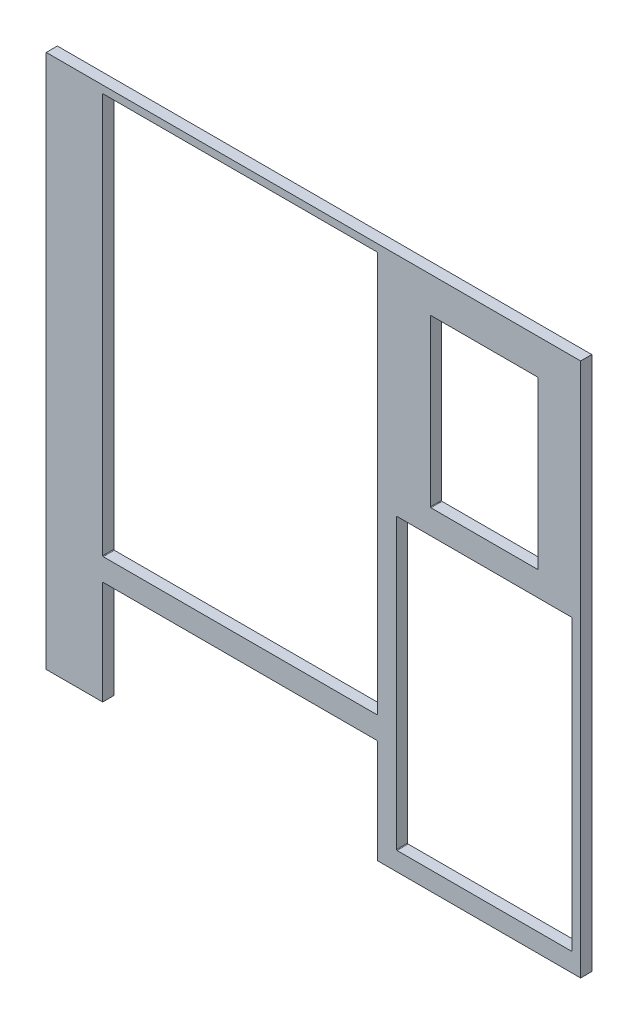
ISO-10303-21;
HEADER;
FILE_DESCRIPTION(('STEP AP214'),'2;1');
FILE_NAME('part.step','',(''),(''),'','','');
FILE_SCHEMA(('AUTOMOTIVE_DESIGN { 1 0 10303 214 1 1 1 1 }'));
ENDSEC;
DATA;
#1=APPLICATION_CONTEXT('core data for automotive mechanical design processes');
#2=APPLICATION_PROTOCOL_DEFINITION('international standard','automotive_design',2000,#1);
#3=PRODUCT_CONTEXT('',#1,'mechanical');
#4=PRODUCT('Part','Part','',(#3));
#5=PRODUCT_RELATED_PRODUCT_CATEGORY('part','',(#4));
#6=PRODUCT_DEFINITION_FORMATION('','',#4);
#7=PRODUCT_DEFINITION_CONTEXT('part definition',#1,'design');
#8=PRODUCT_DEFINITION('design','',#6,#7);
#9=PRODUCT_DEFINITION_SHAPE('','',#8);
#10=(LENGTH_UNIT() NAMED_UNIT(*) SI_UNIT(.MILLI.,.METRE.));
#11=(NAMED_UNIT(*) PLANE_ANGLE_UNIT() SI_UNIT($,.RADIAN.));
#12=(NAMED_UNIT(*) SI_UNIT($,.STERADIAN.) SOLID_ANGLE_UNIT());
#13=UNCERTAINTY_MEASURE_WITH_UNIT(LENGTH_MEASURE(1.E-05),#10,'distance_accuracy_value','');
#14=(GEOMETRIC_REPRESENTATION_CONTEXT(3) GLOBAL_UNCERTAINTY_ASSIGNED_CONTEXT((#13)) GLOBAL_UNIT_ASSIGNED_CONTEXT((#10,
#11,#12)) REPRESENTATION_CONTEXT('',''));
#15=CARTESIAN_POINT('',(0.,0.,0.));
#16=DIRECTION('',(0.,0.,1.));
#17=DIRECTION('',(1.,0.,0.));
#18=AXIS2_PLACEMENT_3D('',#15,#16,#17);
#19=CARTESIAN_POINT('',(457.2,-457.2,9.525));
#20=DIRECTION('',(0.,1.,0.));
#21=DIRECTION('',(-1.,0.,0.));
#22=AXIS2_PLACEMENT_3D('',#19,#20,#21);
#23=PLANE('',#22);
#24=DIRECTION('',(1.,0.,0.));
#25=VECTOR('',#24,1.);
#26=CARTESIAN_POINT('',(457.2,-457.2,-9.525));
#27=LINE('',#26,#25);
#28=CARTESIAN_POINT('',(-457.2,-457.2,-9.525));
#29=VERTEX_POINT('',#28);
#30=CARTESIAN_POINT('',(-360.68,-457.2,-9.525));
#31=VERTEX_POINT('',#30);
#32=EDGE_CURVE('E260',#29,#31,#27,.T.);
#33=ORIENTED_EDGE('',*,*,#32,.T.);
#34=DIRECTION('',(0.,0.,1.));
#35=VECTOR('',#34,1.);
#36=CARTESIAN_POINT('',(-360.68,-457.2,-9.525));
#37=LINE('',#36,#35);
#38=CARTESIAN_POINT('',(-360.68,-457.2,9.525));
#39=VERTEX_POINT('',#38);
#40=EDGE_CURVE('E272',#31,#39,#37,.T.);
#41=ORIENTED_EDGE('',*,*,#40,.T.);
#42=DIRECTION('',(1.,0.,0.));
#43=VECTOR('',#42,1.);
#44=CARTESIAN_POINT('',(457.2,-457.2,9.525));
#45=LINE('',#44,#43);
#46=CARTESIAN_POINT('',(-457.2,-457.2,9.525));
#47=VERTEX_POINT('',#46);
#48=EDGE_CURVE('E493',#47,#39,#45,.T.);
#49=ORIENTED_EDGE('',*,*,#48,.F.);
#50=DIRECTION('',(0.,0.,-1.));
#51=VECTOR('',#50,1.);
#52=CARTESIAN_POINT('',(-457.2,-457.2,9.525));
#53=LINE('',#52,#51);
#54=EDGE_CURVE('E282',#47,#29,#53,.T.);
#55=ORIENTED_EDGE('',*,*,#54,.T.);
#56=EDGE_LOOP('',(#33,#41,#49,#55));
#57=FACE_BOUND('',#56,.T.);
#58=ADVANCED_FACE('F33',(#57),#23,.F.);
#59=CARTESIAN_POINT('',(-457.2,-457.2,9.525));
#60=DIRECTION('',(1.,0.,0.));
#61=DIRECTION('',(0.,0.,-1.));
#62=AXIS2_PLACEMENT_3D('',#59,#60,#61);
#63=PLANE('',#62);
#64=DIRECTION('',(0.,-1.,0.));
#65=VECTOR('',#64,1.);
#66=CARTESIAN_POINT('',(-457.2,-457.2,-9.525));
#67=LINE('',#66,#65);
#68=CARTESIAN_POINT('',(-457.2,457.2,-9.525));
#69=VERTEX_POINT('',#68);
#70=EDGE_CURVE('E289',#69,#29,#67,.T.);
#71=ORIENTED_EDGE('',*,*,#70,.T.);
#72=ORIENTED_EDGE('',*,*,#54,.F.);
#73=DIRECTION('',(0.,-1.,0.));
#74=VECTOR('',#73,1.);
#75=CARTESIAN_POINT('',(-457.2,-457.2,9.525));
#76=LINE('',#75,#74);
#77=CARTESIAN_POINT('',(-457.2,457.2,9.525));
#78=VERTEX_POINT('',#77);
#79=EDGE_CURVE('E294',#78,#47,#76,.T.);
#80=ORIENTED_EDGE('',*,*,#79,.F.);
#81=DIRECTION('',(0.,0.,-1.));
#82=VECTOR('',#81,1.);
#83=CARTESIAN_POINT('',(-457.2,457.2,9.525));
#84=LINE('',#83,#82);
#85=EDGE_CURVE('E295',#78,#69,#84,.T.);
#86=ORIENTED_EDGE('',*,*,#85,.T.);
#87=EDGE_LOOP('',(#71,#72,#80,#86));
#88=FACE_BOUND('',#87,.T.);
#89=ADVANCED_FACE('F506',(#88),#63,.F.);
#90=CARTESIAN_POINT('',(109.22,-457.2,9.525));
#91=VERTEX_POINT('',#90);
#92=CARTESIAN_POINT('',(457.2,-457.2,9.525));
#93=VERTEX_POINT('',#92);
#94=EDGE_CURVE('E492',#91,#93,#45,.T.);
#95=ORIENTED_EDGE('',*,*,#94,.F.);
#96=DIRECTION('',(0.,0.,1.));
#97=VECTOR('',#96,1.);
#98=CARTESIAN_POINT('',(109.22,-457.2,-9.525));
#99=LINE('',#98,#97);
#100=CARTESIAN_POINT('',(109.22,-457.2,-9.525));
#101=VERTEX_POINT('',#100);
#102=EDGE_CURVE('E278',#101,#91,#99,.T.);
#103=ORIENTED_EDGE('',*,*,#102,.F.);
#104=CARTESIAN_POINT('',(457.2,-457.2,-9.525));
#105=VERTEX_POINT('',#104);
#106=EDGE_CURVE('E285',#101,#105,#27,.T.);
#107=ORIENTED_EDGE('',*,*,#106,.T.);
#108=DIRECTION('',(0.,0.,-1.));
#109=VECTOR('',#108,1.);
#110=CARTESIAN_POINT('',(457.2,-457.2,9.525));
#111=LINE('',#110,#109);
#112=EDGE_CURVE('E302',#93,#105,#111,.T.);
#113=ORIENTED_EDGE('',*,*,#112,.F.);
#114=EDGE_LOOP('',(#95,#103,#107,#113));
#115=FACE_BOUND('',#114,.T.);
#116=ADVANCED_FACE('F514',(#115),#23,.F.);
#117=CARTESIAN_POINT('',(457.2,-457.2,9.525));
#118=DIRECTION('',(-1.,0.,0.));
#119=DIRECTION('',(0.,0.,1.));
#120=AXIS2_PLACEMENT_3D('',#117,#118,#119);
#121=PLANE('',#120);
#122=DIRECTION('',(0.,1.,0.));
#123=VECTOR('',#122,1.);
#124=CARTESIAN_POINT('',(457.2,-457.2,-9.525));
#125=LINE('',#124,#123);
#126=CARTESIAN_POINT('',(457.2,457.2,-9.525));
#127=VERTEX_POINT('',#126);
#128=EDGE_CURVE('E284',#105,#127,#125,.T.);
#129=ORIENTED_EDGE('',*,*,#128,.T.);
#130=DIRECTION('',(0.,0.,-1.));
#131=VECTOR('',#130,1.);
#132=CARTESIAN_POINT('',(457.2,457.2,9.525));
#133=LINE('',#132,#131);
#134=CARTESIAN_POINT('',(457.2,457.2,9.525));
#135=VERTEX_POINT('',#134);
#136=EDGE_CURVE('E298',#135,#127,#133,.T.);
#137=ORIENTED_EDGE('',*,*,#136,.F.);
#138=DIRECTION('',(0.,1.,0.));
#139=VECTOR('',#138,1.);
#140=CARTESIAN_POINT('',(457.2,-457.2,9.525));
#141=LINE('',#140,#139);
#142=EDGE_CURVE('E495',#93,#135,#141,.T.);
#143=ORIENTED_EDGE('',*,*,#142,.F.);
#144=ORIENTED_EDGE('',*,*,#112,.T.);
#145=EDGE_LOOP('',(#129,#137,#143,#144));
#146=FACE_BOUND('',#145,.T.);
#147=ADVANCED_FACE('F510',(#146),#121,.F.);
#148=CARTESIAN_POINT('',(457.2,457.2,9.525));
#149=DIRECTION('',(0.,-1.,0.));
#150=DIRECTION('',(1.,0.,0.));
#151=AXIS2_PLACEMENT_3D('',#148,#149,#150);
#152=PLANE('',#151);
#153=DIRECTION('',(-1.,0.,0.));
#154=VECTOR('',#153,1.);
#155=CARTESIAN_POINT('',(457.2,457.2,-9.525));
#156=LINE('',#155,#154);
#157=EDGE_CURVE('E287',#127,#69,#156,.T.);
#158=ORIENTED_EDGE('',*,*,#157,.T.);
#159=ORIENTED_EDGE('',*,*,#85,.F.);
#160=DIRECTION('',(-1.,0.,0.));
#161=VECTOR('',#160,1.);
#162=CARTESIAN_POINT('',(457.2,457.2,9.525));
#163=LINE('',#162,#161);
#164=EDGE_CURVE('E299',#135,#78,#163,.T.);
#165=ORIENTED_EDGE('',*,*,#164,.F.);
#166=ORIENTED_EDGE('',*,*,#136,.T.);
#167=EDGE_LOOP('',(#158,#159,#165,#166));
#168=FACE_BOUND('',#167,.T.);
#169=ADVANCED_FACE('F503',(#168),#152,.F.);
#170=CARTESIAN_POINT('',(0.,0.,9.525));
#171=DIRECTION('',(0.,0.,1.));
#172=DIRECTION('',(1.,0.,0.));
#173=AXIS2_PLACEMENT_3D('',#170,#171,#172);
#174=PLANE('',#173);
#175=DIRECTION('',(0.,-1.,0.));
#176=VECTOR('',#175,1.);
#177=CARTESIAN_POINT('',(142.1,69.7,9.525));
#178=LINE('',#177,#176);
#179=CARTESIAN_POINT('',(142.1,68.7,9.525));
#180=VERTEX_POINT('',#179);
#181=CARTESIAN_POINT('',(142.1,-424.3,9.525));
#182=VERTEX_POINT('',#181);
#183=EDGE_CURVE('E458',#180,#182,#178,.T.);
#184=ORIENTED_EDGE('',*,*,#183,.F.);
#185=CARTESIAN_POINT('',(143.1,68.7,9.525));
#186=DIRECTION('',(0.,0.,1.));
#187=DIRECTION('',(1.,0.,0.));
#188=AXIS2_PLACEMENT_3D('',#185,#186,#187);
#189=CIRCLE('',#188,1.);
#190=CARTESIAN_POINT('',(143.1,69.7,9.525));
#191=VERTEX_POINT('',#190);
#192=EDGE_CURVE('E378',#180,#191,#189,.F.);
#193=ORIENTED_EDGE('',*,*,#192,.T.);
#194=DIRECTION('',(-1.,0.,0.));
#195=VECTOR('',#194,1.);
#196=CARTESIAN_POINT('',(142.1,69.7,9.525));
#197=LINE('',#196,#195);
#198=CARTESIAN_POINT('',(441.1,69.7000000000001,9.525));
#199=VERTEX_POINT('',#198);
#200=EDGE_CURVE('E453',#199,#191,#197,.T.);
#201=ORIENTED_EDGE('',*,*,#200,.F.);
#202=CARTESIAN_POINT('',(441.1,68.7000000000001,9.525));
#203=DIRECTION('',(0.,0.,1.));
#204=DIRECTION('',(1.,0.,0.));
#205=AXIS2_PLACEMENT_3D('',#202,#203,#204);
#206=CIRCLE('',#205,1.);
#207=CARTESIAN_POINT('',(442.1,68.7000000000001,9.525));
#208=VERTEX_POINT('',#207);
#209=EDGE_CURVE('E382',#199,#208,#206,.F.);
#210=ORIENTED_EDGE('',*,*,#209,.T.);
#211=DIRECTION('',(0.,1.,0.));
#212=VECTOR('',#211,1.);
#213=CARTESIAN_POINT('',(442.1,69.7000000000001,9.525));
#214=LINE('',#213,#212);
#215=CARTESIAN_POINT('',(442.1,-424.3,9.525));
#216=VERTEX_POINT('',#215);
#217=EDGE_CURVE('E538',#216,#208,#214,.T.);
#218=ORIENTED_EDGE('',*,*,#217,.F.);
#219=CARTESIAN_POINT('',(441.1,-424.3,9.525));
#220=DIRECTION('',(0.,0.,1.));
#221=DIRECTION('',(1.,0.,0.));
#222=AXIS2_PLACEMENT_3D('',#219,#220,#221);
#223=CIRCLE('',#222,1.);
#224=CARTESIAN_POINT('',(441.1,-425.3,9.525));
#225=VERTEX_POINT('',#224);
#226=EDGE_CURVE('E386',#216,#225,#223,.F.);
#227=ORIENTED_EDGE('',*,*,#226,.T.);
#228=DIRECTION('',(1.,0.,0.));
#229=VECTOR('',#228,1.);
#230=CARTESIAN_POINT('',(142.1,-425.3,9.525));
#231=LINE('',#230,#229);
#232=CARTESIAN_POINT('',(143.1,-425.3,9.525));
#233=VERTEX_POINT('',#232);
#234=EDGE_CURVE('E536',#233,#225,#231,.T.);
#235=ORIENTED_EDGE('',*,*,#234,.F.);
#236=CARTESIAN_POINT('',(143.1,-424.3,9.525));
#237=DIRECTION('',(0.,0.,1.));
#238=DIRECTION('',(1.,0.,0.));
#239=AXIS2_PLACEMENT_3D('',#236,#237,#238);
#240=CIRCLE('',#239,1.);
#241=EDGE_CURVE('E374',#233,#182,#240,.F.);
#242=ORIENTED_EDGE('',*,*,#241,.T.);
#243=EDGE_LOOP('',(#184,#193,#201,#210,#218,#227,#235,#242));
#244=FACE_BOUND('',#243,.T.);
#245=DIRECTION('',(0.,-1.,0.));
#246=VECTOR('',#245,1.);
#247=CARTESIAN_POINT('',(-360.68,444.5,9.525));
#248=LINE('',#247,#246);
#249=CARTESIAN_POINT('',(-360.68,443.5,9.525));
#250=VERTEX_POINT('',#249);
#251=CARTESIAN_POINT('',(-360.68,-240.3,9.525));
#252=VERTEX_POINT('',#251);
#253=EDGE_CURVE('E430',#250,#252,#248,.T.);
#254=ORIENTED_EDGE('',*,*,#253,.F.);
#255=CARTESIAN_POINT('',(-359.68,443.5,9.525));
#256=DIRECTION('',(0.,0.,1.));
#257=DIRECTION('',(1.,0.,0.));
#258=AXIS2_PLACEMENT_3D('',#255,#256,#257);
#259=CIRCLE('',#258,1.);
#260=CARTESIAN_POINT('',(-359.68,444.5,9.525));
#261=VERTEX_POINT('',#260);
#262=EDGE_CURVE('E41',#250,#261,#259,.F.);
#263=ORIENTED_EDGE('',*,*,#262,.T.);
#264=DIRECTION('',(-1.,0.,0.));
#265=VECTOR('',#264,1.);
#266=CARTESIAN_POINT('',(-360.68,444.5,9.525));
#267=LINE('',#266,#265);
#268=CARTESIAN_POINT('',(108.22,444.5,9.525));
#269=VERTEX_POINT('',#268);
#270=EDGE_CURVE('E428',#269,#261,#267,.T.);
#271=ORIENTED_EDGE('',*,*,#270,.F.);
#272=CARTESIAN_POINT('',(108.22,443.5,9.525));
#273=DIRECTION('',(0.,0.,1.));
#274=DIRECTION('',(1.,0.,0.));
#275=AXIS2_PLACEMENT_3D('',#272,#273,#274);
#276=CIRCLE('',#275,1.);
#277=CARTESIAN_POINT('',(109.22,443.5,9.525));
#278=VERTEX_POINT('',#277);
#279=EDGE_CURVE('E421',#269,#278,#276,.F.);
#280=ORIENTED_EDGE('',*,*,#279,.T.);
#281=DIRECTION('',(0.,1.,0.));
#282=VECTOR('',#281,1.);
#283=CARTESIAN_POINT('',(109.22,444.5,9.525));
#284=LINE('',#283,#282);
#285=CARTESIAN_POINT('',(109.22,-240.3,9.525));
#286=VERTEX_POINT('',#285);
#287=EDGE_CURVE('E436',#286,#278,#284,.T.);
#288=ORIENTED_EDGE('',*,*,#287,.F.);
#289=CARTESIAN_POINT('',(108.22,-240.3,9.525));
#290=DIRECTION('',(0.,0.,1.));
#291=DIRECTION('',(1.,0.,0.));
#292=AXIS2_PLACEMENT_3D('',#289,#290,#291);
#293=CIRCLE('',#292,1.);
#294=CARTESIAN_POINT('',(108.22,-241.3,9.525));
#295=VERTEX_POINT('',#294);
#296=EDGE_CURVE('E417',#286,#295,#293,.F.);
#297=ORIENTED_EDGE('',*,*,#296,.T.);
#298=DIRECTION('',(1.,0.,0.));
#299=VECTOR('',#298,1.);
#300=CARTESIAN_POINT('',(-360.68,-241.3,9.525));
#301=LINE('',#300,#299);
#302=CARTESIAN_POINT('',(-359.68,-241.3,9.525));
#303=VERTEX_POINT('',#302);
#304=EDGE_CURVE('E460',#303,#295,#301,.T.);
#305=ORIENTED_EDGE('',*,*,#304,.F.);
#306=CARTESIAN_POINT('',(-359.68,-240.3,9.525));
#307=DIRECTION('',(0.,0.,1.));
#308=DIRECTION('',(1.,0.,0.));
#309=AXIS2_PLACEMENT_3D('',#306,#307,#308);
#310=CIRCLE('',#309,1.);
#311=EDGE_CURVE('E413',#303,#252,#310,.F.);
#312=ORIENTED_EDGE('',*,*,#311,.T.);
#313=EDGE_LOOP('',(#254,#263,#271,#280,#288,#297,#305,#312));
#314=FACE_BOUND('',#313,.T.);
#315=DIRECTION('',(0.,-1.,0.));
#316=VECTOR('',#315,1.);
#317=CARTESIAN_POINT('',(-360.68,-279.4,9.525));
#318=LINE('',#317,#316);
#319=CARTESIAN_POINT('',(-360.68,-280.4,9.525));
#320=VERTEX_POINT('',#319);
#321=EDGE_CURVE('E275',#320,#39,#318,.T.);
#322=ORIENTED_EDGE('',*,*,#321,.F.);
#323=CARTESIAN_POINT('',(-359.68,-280.4,9.525));
#324=DIRECTION('',(0.,0.,1.));
#325=DIRECTION('',(1.,0.,0.));
#326=AXIS2_PLACEMENT_3D('',#323,#324,#325);
#327=CIRCLE('',#326,1.);
#328=CARTESIAN_POINT('',(-359.68,-279.4,9.525));
#329=VERTEX_POINT('',#328);
#330=EDGE_CURVE('E410',#320,#329,#327,.F.);
#331=ORIENTED_EDGE('',*,*,#330,.T.);
#332=DIRECTION('',(-1.,0.,0.));
#333=VECTOR('',#332,1.);
#334=CARTESIAN_POINT('',(-360.68,-279.4,9.525));
#335=LINE('',#334,#333);
#336=CARTESIAN_POINT('',(108.22,-279.4,9.525));
#337=VERTEX_POINT('',#336);
#338=EDGE_CURVE('E269',#337,#329,#335,.T.);
#339=ORIENTED_EDGE('',*,*,#338,.F.);
#340=CARTESIAN_POINT('',(108.22,-280.4,9.525));
#341=DIRECTION('',(0.,0.,1.));
#342=DIRECTION('',(1.,0.,0.));
#343=AXIS2_PLACEMENT_3D('',#340,#341,#342);
#344=CIRCLE('',#343,1.);
#345=CARTESIAN_POINT('',(109.22,-280.4,9.525));
#346=VERTEX_POINT('',#345);
#347=EDGE_CURVE('E406',#337,#346,#344,.F.);
#348=ORIENTED_EDGE('',*,*,#347,.T.);
#349=DIRECTION('',(0.,1.,0.));
#350=VECTOR('',#349,1.);
#351=CARTESIAN_POINT('',(109.22,-279.4,9.525));
#352=LINE('',#351,#350);
#353=EDGE_CURVE('E903',#91,#346,#352,.T.);
#354=ORIENTED_EDGE('',*,*,#353,.F.);
#355=ORIENTED_EDGE('',*,*,#94,.T.);
#356=ORIENTED_EDGE('',*,*,#142,.T.);
#357=ORIENTED_EDGE('',*,*,#164,.T.);
#358=ORIENTED_EDGE('',*,*,#79,.T.);
#359=ORIENTED_EDGE('',*,*,#48,.T.);
#360=EDGE_LOOP('',(#322,#331,#339,#348,#354,#355,#356,#357,#358,#359));
#361=FACE_BOUND('',#360,.T.);
#362=DIRECTION('',(0.,-1.,0.));
#363=VECTOR('',#362,1.);
#364=CARTESIAN_POINT('',(200.1,396.5,9.525));
#365=LINE('',#364,#363);
#366=CARTESIAN_POINT('',(200.1,395.5,9.525));
#367=VERTEX_POINT('',#366);
#368=CARTESIAN_POINT('',(200.1,112.5,9.525));
#369=VERTEX_POINT('',#368);
#370=EDGE_CURVE('E478',#367,#369,#365,.T.);
#371=ORIENTED_EDGE('',*,*,#370,.F.);
#372=CARTESIAN_POINT('',(201.1,395.5,9.525));
#373=DIRECTION('',(0.,0.,1.));
#374=DIRECTION('',(1.,0.,0.));
#375=AXIS2_PLACEMENT_3D('',#372,#373,#374);
#376=CIRCLE('',#375,1.);
#377=CARTESIAN_POINT('',(201.1,396.5,9.525));
#378=VERTEX_POINT('',#377);
#379=EDGE_CURVE('E402',#367,#378,#376,.F.);
#380=ORIENTED_EDGE('',*,*,#379,.T.);
#381=DIRECTION('',(-1.,0.,0.));
#382=VECTOR('',#381,1.);
#383=CARTESIAN_POINT('',(200.1,396.5,9.525));
#384=LINE('',#383,#382);
#385=CARTESIAN_POINT('',(383.1,396.5,9.525));
#386=VERTEX_POINT('',#385);
#387=EDGE_CURVE('E469',#386,#378,#384,.T.);
#388=ORIENTED_EDGE('',*,*,#387,.F.);
#389=CARTESIAN_POINT('',(383.1,395.5,9.525));
#390=DIRECTION('',(0.,0.,1.));
#391=DIRECTION('',(1.,0.,0.));
#392=AXIS2_PLACEMENT_3D('',#389,#390,#391);
#393=CIRCLE('',#392,1.);
#394=CARTESIAN_POINT('',(384.1,395.5,9.525));
#395=VERTEX_POINT('',#394);
#396=EDGE_CURVE('E398',#386,#395,#393,.F.);
#397=ORIENTED_EDGE('',*,*,#396,.T.);
#398=DIRECTION('',(0.,1.,0.));
#399=VECTOR('',#398,1.);
#400=CARTESIAN_POINT('',(384.1,396.5,9.525));
#401=LINE('',#400,#399);
#402=CARTESIAN_POINT('',(384.1,112.5,9.525));
#403=VERTEX_POINT('',#402);
#404=EDGE_CURVE('E485',#403,#395,#401,.T.);
#405=ORIENTED_EDGE('',*,*,#404,.F.);
#406=CARTESIAN_POINT('',(383.1,112.5,9.525));
#407=DIRECTION('',(0.,0.,1.));
#408=DIRECTION('',(1.,0.,0.));
#409=AXIS2_PLACEMENT_3D('',#406,#407,#408);
#410=CIRCLE('',#409,1.);
#411=CARTESIAN_POINT('',(383.1,111.5,9.525));
#412=VERTEX_POINT('',#411);
#413=EDGE_CURVE('E394',#403,#412,#410,.F.);
#414=ORIENTED_EDGE('',*,*,#413,.T.);
#415=DIRECTION('',(1.,0.,0.));
#416=VECTOR('',#415,1.);
#417=CARTESIAN_POINT('',(200.1,111.5,9.525));
#418=LINE('',#417,#416);
#419=CARTESIAN_POINT('',(201.1,111.5,9.525));
#420=VERTEX_POINT('',#419);
#421=EDGE_CURVE('E481',#420,#412,#418,.T.);
#422=ORIENTED_EDGE('',*,*,#421,.F.);
#423=CARTESIAN_POINT('',(201.1,112.5,9.525));
#424=DIRECTION('',(0.,0.,1.));
#425=DIRECTION('',(1.,0.,0.));
#426=AXIS2_PLACEMENT_3D('',#423,#424,#425);
#427=CIRCLE('',#426,1.);
#428=EDGE_CURVE('E390',#420,#369,#427,.F.);
#429=ORIENTED_EDGE('',*,*,#428,.T.);
#430=EDGE_LOOP('',(#371,#380,#388,#397,#405,#414,#422,#429));
#431=FACE_BOUND('',#430,.T.);
#432=ADVANCED_FACE('F426',(#244,#314,#361,#431),#174,.T.);
#433=CARTESIAN_POINT('',(0.,0.,-9.525));
#434=DIRECTION('',(0.,0.,1.));
#435=DIRECTION('',(1.,0.,0.));
#436=AXIS2_PLACEMENT_3D('',#433,#434,#435);
#437=PLANE('',#436);
#438=DIRECTION('',(0.,1.,0.));
#439=VECTOR('',#438,1.);
#440=CARTESIAN_POINT('',(442.1,69.7000000000001,-9.525));
#441=LINE('',#440,#439);
#442=CARTESIAN_POINT('',(442.1,-424.3,-9.525));
#443=VERTEX_POINT('',#442);
#444=CARTESIAN_POINT('',(442.1,68.7000000000001,-9.525));
#445=VERTEX_POINT('',#444);
#446=EDGE_CURVE('E529',#443,#445,#441,.T.);
#447=ORIENTED_EDGE('',*,*,#446,.T.);
#448=CARTESIAN_POINT('',(441.1,68.7000000000001,-9.525));
#449=DIRECTION('',(0.,0.,1.));
#450=DIRECTION('',(1.,0.,0.));
#451=AXIS2_PLACEMENT_3D('',#448,#449,#450);
#452=CIRCLE('',#451,1.);
#453=CARTESIAN_POINT('',(441.1,69.7000000000001,-9.525));
#454=VERTEX_POINT('',#453);
#455=EDGE_CURVE('E384',#445,#454,#452,.T.);
#456=ORIENTED_EDGE('',*,*,#455,.T.);
#457=DIRECTION('',(-1.,0.,0.));
#458=VECTOR('',#457,1.);
#459=CARTESIAN_POINT('',(142.1,69.7,-9.525));
#460=LINE('',#459,#458);
#461=CARTESIAN_POINT('',(143.1,69.7,-9.525));
#462=VERTEX_POINT('',#461);
#463=EDGE_CURVE('E482',#454,#462,#460,.T.);
#464=ORIENTED_EDGE('',*,*,#463,.T.);
#465=CARTESIAN_POINT('',(143.1,68.7,-9.525));
#466=DIRECTION('',(0.,0.,1.));
#467=DIRECTION('',(1.,0.,0.));
#468=AXIS2_PLACEMENT_3D('',#465,#466,#467);
#469=CIRCLE('',#468,1.);
#470=CARTESIAN_POINT('',(142.1,68.7,-9.525));
#471=VERTEX_POINT('',#470);
#472=EDGE_CURVE('E380',#462,#471,#469,.T.);
#473=ORIENTED_EDGE('',*,*,#472,.T.);
#474=DIRECTION('',(0.,-1.,0.));
#475=VECTOR('',#474,1.);
#476=CARTESIAN_POINT('',(142.1,69.7,-9.525));
#477=LINE('',#476,#475);
#478=CARTESIAN_POINT('',(142.1,-424.3,-9.525));
#479=VERTEX_POINT('',#478);
#480=EDGE_CURVE('E523',#471,#479,#477,.T.);
#481=ORIENTED_EDGE('',*,*,#480,.T.);
#482=CARTESIAN_POINT('',(143.1,-424.3,-9.525));
#483=DIRECTION('',(0.,0.,1.));
#484=DIRECTION('',(1.,0.,0.));
#485=AXIS2_PLACEMENT_3D('',#482,#483,#484);
#486=CIRCLE('',#485,1.);
#487=CARTESIAN_POINT('',(143.1,-425.3,-9.525));
#488=VERTEX_POINT('',#487);
#489=EDGE_CURVE('E376',#479,#488,#486,.T.);
#490=ORIENTED_EDGE('',*,*,#489,.T.);
#491=DIRECTION('',(1.,0.,0.));
#492=VECTOR('',#491,1.);
#493=CARTESIAN_POINT('',(142.1,-425.3,-9.525));
#494=LINE('',#493,#492);
#495=CARTESIAN_POINT('',(441.1,-425.3,-9.525));
#496=VERTEX_POINT('',#495);
#497=EDGE_CURVE('E526',#488,#496,#494,.T.);
#498=ORIENTED_EDGE('',*,*,#497,.T.);
#499=CARTESIAN_POINT('',(441.1,-424.3,-9.525));
#500=DIRECTION('',(0.,0.,1.));
#501=DIRECTION('',(1.,0.,0.));
#502=AXIS2_PLACEMENT_3D('',#499,#500,#501);
#503=CIRCLE('',#502,1.);
#504=EDGE_CURVE('E388',#496,#443,#503,.T.);
#505=ORIENTED_EDGE('',*,*,#504,.T.);
#506=EDGE_LOOP('',(#447,#456,#464,#473,#481,#490,#498,#505));
#507=FACE_BOUND('',#506,.T.);
#508=DIRECTION('',(0.,1.,0.));
#509=VECTOR('',#508,1.);
#510=CARTESIAN_POINT('',(109.22,444.5,-9.525));
#511=LINE('',#510,#509);
#512=CARTESIAN_POINT('',(109.22,-240.3,-9.525));
#513=VERTEX_POINT('',#512);
#514=CARTESIAN_POINT('',(109.22,443.5,-9.525));
#515=VERTEX_POINT('',#514);
#516=EDGE_CURVE('E450',#513,#515,#511,.T.);
#517=ORIENTED_EDGE('',*,*,#516,.T.);
#518=CARTESIAN_POINT('',(108.22,443.5,-9.525));
#519=DIRECTION('',(0.,0.,1.));
#520=DIRECTION('',(1.,0.,0.));
#521=AXIS2_PLACEMENT_3D('',#518,#519,#520);
#522=CIRCLE('',#521,1.);
#523=CARTESIAN_POINT('',(108.22,444.5,-9.525));
#524=VERTEX_POINT('',#523);
#525=EDGE_CURVE('E55',#515,#524,#522,.T.);
#526=ORIENTED_EDGE('',*,*,#525,.T.);
#527=DIRECTION('',(-1.,0.,0.));
#528=VECTOR('',#527,1.);
#529=CARTESIAN_POINT('',(-360.68,444.5,-9.525));
#530=LINE('',#529,#528);
#531=CARTESIAN_POINT('',(-359.68,444.5,-9.525));
#532=VERTEX_POINT('',#531);
#533=EDGE_CURVE('E443',#524,#532,#530,.T.);
#534=ORIENTED_EDGE('',*,*,#533,.T.);
#535=CARTESIAN_POINT('',(-359.68,443.5,-9.525));
#536=DIRECTION('',(0.,0.,1.));
#537=DIRECTION('',(1.,0.,0.));
#538=AXIS2_PLACEMENT_3D('',#535,#536,#537);
#539=CIRCLE('',#538,1.);
#540=CARTESIAN_POINT('',(-360.68,443.5,-9.525));
#541=VERTEX_POINT('',#540);
#542=EDGE_CURVE('E11',#532,#541,#539,.T.);
#543=ORIENTED_EDGE('',*,*,#542,.T.);
#544=DIRECTION('',(0.,-1.,0.));
#545=VECTOR('',#544,1.);
#546=CARTESIAN_POINT('',(-360.68,444.5,-9.525));
#547=LINE('',#546,#545);
#548=CARTESIAN_POINT('',(-360.68,-240.3,-9.525));
#549=VERTEX_POINT('',#548);
#550=EDGE_CURVE('E435',#541,#549,#547,.T.);
#551=ORIENTED_EDGE('',*,*,#550,.T.);
#552=CARTESIAN_POINT('',(-359.68,-240.3,-9.525));
#553=DIRECTION('',(0.,0.,1.));
#554=DIRECTION('',(1.,0.,0.));
#555=AXIS2_PLACEMENT_3D('',#552,#553,#554);
#556=CIRCLE('',#555,1.);
#557=CARTESIAN_POINT('',(-359.68,-241.3,-9.525));
#558=VERTEX_POINT('',#557);
#559=EDGE_CURVE('E415',#549,#558,#556,.T.);
#560=ORIENTED_EDGE('',*,*,#559,.T.);
#561=DIRECTION('',(1.,0.,0.));
#562=VECTOR('',#561,1.);
#563=CARTESIAN_POINT('',(-360.68,-241.3,-9.525));
#564=LINE('',#563,#562);
#565=CARTESIAN_POINT('',(108.22,-241.3,-9.525));
#566=VERTEX_POINT('',#565);
#567=EDGE_CURVE('E447',#558,#566,#564,.T.);
#568=ORIENTED_EDGE('',*,*,#567,.T.);
#569=CARTESIAN_POINT('',(108.22,-240.3,-9.525));
#570=DIRECTION('',(0.,0.,1.));
#571=DIRECTION('',(1.,0.,0.));
#572=AXIS2_PLACEMENT_3D('',#569,#570,#571);
#573=CIRCLE('',#572,1.);
#574=EDGE_CURVE('E419',#566,#513,#573,.T.);
#575=ORIENTED_EDGE('',*,*,#574,.T.);
#576=EDGE_LOOP('',(#517,#526,#534,#543,#551,#560,#568,#575));
#577=FACE_BOUND('',#576,.T.);
#578=DIRECTION('',(0.,1.,0.));
#579=VECTOR('',#578,1.);
#580=CARTESIAN_POINT('',(384.1,396.5,-9.525));
#581=LINE('',#580,#579);
#582=CARTESIAN_POINT('',(384.1,112.5,-9.525));
#583=VERTEX_POINT('',#582);
#584=CARTESIAN_POINT('',(384.1,395.5,-9.525));
#585=VERTEX_POINT('',#584);
#586=EDGE_CURVE('E472',#583,#585,#581,.T.);
#587=ORIENTED_EDGE('',*,*,#586,.T.);
#588=CARTESIAN_POINT('',(383.1,395.5,-9.525));
#589=DIRECTION('',(0.,0.,1.));
#590=DIRECTION('',(1.,0.,0.));
#591=AXIS2_PLACEMENT_3D('',#588,#589,#590);
#592=CIRCLE('',#591,1.);
#593=CARTESIAN_POINT('',(383.1,396.5,-9.525));
#594=VERTEX_POINT('',#593);
#595=EDGE_CURVE('E400',#585,#594,#592,.T.);
#596=ORIENTED_EDGE('',*,*,#595,.T.);
#597=DIRECTION('',(-1.,0.,0.));
#598=VECTOR('',#597,1.);
#599=CARTESIAN_POINT('',(200.1,396.5,-9.525));
#600=LINE('',#599,#598);
#601=CARTESIAN_POINT('',(201.1,396.5,-9.525));
#602=VERTEX_POINT('',#601);
#603=EDGE_CURVE('E475',#594,#602,#600,.T.);
#604=ORIENTED_EDGE('',*,*,#603,.T.);
#605=CARTESIAN_POINT('',(201.1,395.5,-9.525));
#606=DIRECTION('',(0.,0.,1.));
#607=DIRECTION('',(1.,0.,0.));
#608=AXIS2_PLACEMENT_3D('',#605,#606,#607);
#609=CIRCLE('',#608,1.);
#610=CARTESIAN_POINT('',(200.1,395.5,-9.525));
#611=VERTEX_POINT('',#610);
#612=EDGE_CURVE('E404',#602,#611,#609,.T.);
#613=ORIENTED_EDGE('',*,*,#612,.T.);
#614=DIRECTION('',(0.,-1.,0.));
#615=VECTOR('',#614,1.);
#616=CARTESIAN_POINT('',(200.1,396.5,-9.525));
#617=LINE('',#616,#615);
#618=CARTESIAN_POINT('',(200.1,112.5,-9.525));
#619=VERTEX_POINT('',#618);
#620=EDGE_CURVE('E465',#611,#619,#617,.T.);
#621=ORIENTED_EDGE('',*,*,#620,.T.);
#622=CARTESIAN_POINT('',(201.1,112.5,-9.525));
#623=DIRECTION('',(0.,0.,1.));
#624=DIRECTION('',(1.,0.,0.));
#625=AXIS2_PLACEMENT_3D('',#622,#623,#624);
#626=CIRCLE('',#625,1.);
#627=CARTESIAN_POINT('',(201.1,111.5,-9.525));
#628=VERTEX_POINT('',#627);
#629=EDGE_CURVE('E392',#619,#628,#626,.T.);
#630=ORIENTED_EDGE('',*,*,#629,.T.);
#631=DIRECTION('',(1.,0.,0.));
#632=VECTOR('',#631,1.);
#633=CARTESIAN_POINT('',(200.1,111.5,-9.525));
#634=LINE('',#633,#632);
#635=CARTESIAN_POINT('',(383.1,111.5,-9.525));
#636=VERTEX_POINT('',#635);
#637=EDGE_CURVE('E468',#628,#636,#634,.T.);
#638=ORIENTED_EDGE('',*,*,#637,.T.);
#639=CARTESIAN_POINT('',(383.1,112.5,-9.525));
#640=DIRECTION('',(0.,0.,1.));
#641=DIRECTION('',(1.,0.,0.));
#642=AXIS2_PLACEMENT_3D('',#639,#640,#641);
#643=CIRCLE('',#642,1.);
#644=EDGE_CURVE('E396',#636,#583,#643,.T.);
#645=ORIENTED_EDGE('',*,*,#644,.T.);
#646=EDGE_LOOP('',(#587,#596,#604,#613,#621,#630,#638,#645));
#647=FACE_BOUND('',#646,.T.);
#648=DIRECTION('',(0.,1.,0.));
#649=VECTOR('',#648,1.);
#650=CARTESIAN_POINT('',(109.22,-279.4,-9.525));
#651=LINE('',#650,#649);
#652=CARTESIAN_POINT('',(109.22,-280.4,-9.525));
#653=VERTEX_POINT('',#652);
#654=EDGE_CURVE('E268',#101,#653,#651,.T.);
#655=ORIENTED_EDGE('',*,*,#654,.T.);
#656=CARTESIAN_POINT('',(108.22,-280.4,-9.525));
#657=DIRECTION('',(0.,0.,1.));
#658=DIRECTION('',(1.,0.,0.));
#659=AXIS2_PLACEMENT_3D('',#656,#657,#658);
#660=CIRCLE('',#659,1.);
#661=CARTESIAN_POINT('',(108.22,-279.4,-9.525));
#662=VERTEX_POINT('',#661);
#663=EDGE_CURVE('E408',#653,#662,#660,.T.);
#664=ORIENTED_EDGE('',*,*,#663,.T.);
#665=DIRECTION('',(-1.,0.,0.));
#666=VECTOR('',#665,1.);
#667=CARTESIAN_POINT('',(-360.68,-279.4,-9.525));
#668=LINE('',#667,#666);
#669=CARTESIAN_POINT('',(-359.68,-279.4,-9.525));
#670=VERTEX_POINT('',#669);
#671=EDGE_CURVE('E279',#662,#670,#668,.T.);
#672=ORIENTED_EDGE('',*,*,#671,.T.);
#673=CARTESIAN_POINT('',(-359.68,-280.4,-9.525));
#674=DIRECTION('',(0.,0.,1.));
#675=DIRECTION('',(1.,0.,0.));
#676=AXIS2_PLACEMENT_3D('',#673,#674,#675);
#677=CIRCLE('',#676,1.);
#678=CARTESIAN_POINT('',(-360.68,-280.4,-9.525));
#679=VERTEX_POINT('',#678);
#680=EDGE_CURVE('E264',#670,#679,#677,.T.);
#681=ORIENTED_EDGE('',*,*,#680,.T.);
#682=DIRECTION('',(0.,-1.,0.));
#683=VECTOR('',#682,1.);
#684=CARTESIAN_POINT('',(-360.68,-279.4,-9.525));
#685=LINE('',#684,#683);
#686=EDGE_CURVE('E254',#679,#31,#685,.T.);
#687=ORIENTED_EDGE('',*,*,#686,.T.);
#688=ORIENTED_EDGE('',*,*,#32,.F.);
#689=ORIENTED_EDGE('',*,*,#70,.F.);
#690=ORIENTED_EDGE('',*,*,#157,.F.);
#691=ORIENTED_EDGE('',*,*,#128,.F.);
#692=ORIENTED_EDGE('',*,*,#106,.F.);
#693=EDGE_LOOP('',(#655,#664,#672,#681,#687,#688,#689,#690,#691,#692));
#694=FACE_BOUND('',#693,.T.);
#695=ADVANCED_FACE('F257',(#507,#577,#647,#694),#437,.F.);
#696=CARTESIAN_POINT('',(200.1,396.5,-9.525));
#697=DIRECTION('',(-1.,0.,0.));
#698=DIRECTION('',(0.,0.,1.));
#699=AXIS2_PLACEMENT_3D('',#696,#697,#698);
#700=PLANE('',#699);
#701=ORIENTED_EDGE('',*,*,#370,.T.);
#702=DIRECTION('',(0.,0.,1.));
#703=VECTOR('',#702,1.);
#704=CARTESIAN_POINT('',(200.1,112.5,-9.525));
#705=LINE('',#704,#703);
#706=EDGE_CURVE('E334',#369,#619,#705,.F.);
#707=ORIENTED_EDGE('',*,*,#706,.T.);
#708=ORIENTED_EDGE('',*,*,#620,.F.);
#709=DIRECTION('',(0.,0.,1.));
#710=VECTOR('',#709,1.);
#711=CARTESIAN_POINT('',(200.1,395.5,9.525));
#712=LINE('',#711,#710);
#713=EDGE_CURVE('E331',#611,#367,#712,.T.);
#714=ORIENTED_EDGE('',*,*,#713,.T.);
#715=EDGE_LOOP('',(#701,#707,#708,#714));
#716=FACE_BOUND('',#715,.T.);
#717=ADVANCED_FACE('F585',(#716),#700,.F.);
#718=CARTESIAN_POINT('',(200.1,396.5,-9.525));
#719=DIRECTION('',(0.,1.,0.));
#720=DIRECTION('',(0.,0.,1.));
#721=AXIS2_PLACEMENT_3D('',#718,#719,#720);
#722=PLANE('',#721);
#723=ORIENTED_EDGE('',*,*,#603,.F.);
#724=DIRECTION('',(0.,0.,1.));
#725=VECTOR('',#724,1.);
#726=CARTESIAN_POINT('',(383.1,396.5,9.525));
#727=LINE('',#726,#725);
#728=EDGE_CURVE('E343',#594,#386,#727,.T.);
#729=ORIENTED_EDGE('',*,*,#728,.T.);
#730=ORIENTED_EDGE('',*,*,#387,.T.);
#731=DIRECTION('',(0.,0.,1.));
#732=VECTOR('',#731,1.);
#733=CARTESIAN_POINT('',(201.1,396.5,-9.525));
#734=LINE('',#733,#732);
#735=EDGE_CURVE('E341',#378,#602,#734,.F.);
#736=ORIENTED_EDGE('',*,*,#735,.T.);
#737=EDGE_LOOP('',(#723,#729,#730,#736));
#738=FACE_BOUND('',#737,.T.);
#739=ADVANCED_FACE('F635',(#738),#722,.F.);
#740=CARTESIAN_POINT('',(384.1,396.5,-9.525));
#741=DIRECTION('',(1.,0.,0.));
#742=DIRECTION('',(0.,0.,-1.));
#743=AXIS2_PLACEMENT_3D('',#740,#741,#742);
#744=PLANE('',#743);
#745=ORIENTED_EDGE('',*,*,#586,.F.);
#746=DIRECTION('',(0.,0.,1.));
#747=VECTOR('',#746,1.);
#748=CARTESIAN_POINT('',(384.1,112.5,9.525));
#749=LINE('',#748,#747);
#750=EDGE_CURVE('E338',#583,#403,#749,.T.);
#751=ORIENTED_EDGE('',*,*,#750,.T.);
#752=ORIENTED_EDGE('',*,*,#404,.T.);
#753=DIRECTION('',(0.,0.,1.));
#754=VECTOR('',#753,1.);
#755=CARTESIAN_POINT('',(384.1,395.5,-9.525));
#756=LINE('',#755,#754);
#757=EDGE_CURVE('E336',#395,#585,#756,.F.);
#758=ORIENTED_EDGE('',*,*,#757,.T.);
#759=EDGE_LOOP('',(#745,#751,#752,#758));
#760=FACE_BOUND('',#759,.T.);
#761=ADVANCED_FACE('F644',(#760),#744,.F.);
#762=CARTESIAN_POINT('',(200.1,111.5,-9.525));
#763=DIRECTION('',(0.,-1.,0.));
#764=DIRECTION('',(0.,0.,-1.));
#765=AXIS2_PLACEMENT_3D('',#762,#763,#764);
#766=PLANE('',#765);
#767=ORIENTED_EDGE('',*,*,#637,.F.);
#768=DIRECTION('',(0.,0.,1.));
#769=VECTOR('',#768,1.);
#770=CARTESIAN_POINT('',(201.1,111.5,9.525));
#771=LINE('',#770,#769);
#772=EDGE_CURVE('E328',#628,#420,#771,.T.);
#773=ORIENTED_EDGE('',*,*,#772,.T.);
#774=ORIENTED_EDGE('',*,*,#421,.T.);
#775=DIRECTION('',(0.,0.,1.));
#776=VECTOR('',#775,1.);
#777=CARTESIAN_POINT('',(383.1,111.5,-9.525));
#778=LINE('',#777,#776);
#779=EDGE_CURVE('E326',#412,#636,#778,.F.);
#780=ORIENTED_EDGE('',*,*,#779,.T.);
#781=EDGE_LOOP('',(#767,#773,#774,#780));
#782=FACE_BOUND('',#781,.T.);
#783=ADVANCED_FACE('F654',(#782),#766,.F.);
#784=CARTESIAN_POINT('',(-360.68,-279.4,-9.525));
#785=DIRECTION('',(-1.,0.,0.));
#786=DIRECTION('',(0.,0.,1.));
#787=AXIS2_PLACEMENT_3D('',#784,#785,#786);
#788=PLANE('',#787);
#789=ORIENTED_EDGE('',*,*,#686,.F.);
#790=DIRECTION('',(0.,0.,1.));
#791=VECTOR('',#790,1.);
#792=CARTESIAN_POINT('',(-360.68,-280.4,9.525));
#793=LINE('',#792,#791);
#794=EDGE_CURVE('E353',#679,#320,#793,.T.);
#795=ORIENTED_EDGE('',*,*,#794,.T.);
#796=ORIENTED_EDGE('',*,*,#321,.T.);
#797=ORIENTED_EDGE('',*,*,#40,.F.);
#798=EDGE_LOOP('',(#789,#795,#796,#797));
#799=FACE_BOUND('',#798,.T.);
#800=ADVANCED_FACE('F273',(#799),#788,.F.);
#801=CARTESIAN_POINT('',(-360.68,-279.4,-9.525));
#802=DIRECTION('',(0.,1.,0.));
#803=DIRECTION('',(0.,0.,1.));
#804=AXIS2_PLACEMENT_3D('',#801,#802,#803);
#805=PLANE('',#804);
#806=ORIENTED_EDGE('',*,*,#671,.F.);
#807=DIRECTION('',(0.,0.,1.));
#808=VECTOR('',#807,1.);
#809=CARTESIAN_POINT('',(108.22,-279.4,9.525));
#810=LINE('',#809,#808);
#811=EDGE_CURVE('E348',#662,#337,#810,.T.);
#812=ORIENTED_EDGE('',*,*,#811,.T.);
#813=ORIENTED_EDGE('',*,*,#338,.T.);
#814=DIRECTION('',(0.,0.,1.));
#815=VECTOR('',#814,1.);
#816=CARTESIAN_POINT('',(-359.68,-279.4,-9.525));
#817=LINE('',#816,#815);
#818=EDGE_CURVE('E346',#329,#670,#817,.F.);
#819=ORIENTED_EDGE('',*,*,#818,.T.);
#820=EDGE_LOOP('',(#806,#812,#813,#819));
#821=FACE_BOUND('',#820,.T.);
#822=ADVANCED_FACE('F673',(#821),#805,.F.);
#823=CARTESIAN_POINT('',(109.22,-279.4,-9.525));
#824=DIRECTION('',(1.,0.,0.));
#825=DIRECTION('',(0.,1.,0.));
#826=AXIS2_PLACEMENT_3D('',#823,#824,#825);
#827=PLANE('',#826);
#828=ORIENTED_EDGE('',*,*,#353,.T.);
#829=DIRECTION('',(0.,0.,1.));
#830=VECTOR('',#829,1.);
#831=CARTESIAN_POINT('',(109.22,-280.4,-9.525));
#832=LINE('',#831,#830);
#833=EDGE_CURVE('E351',#346,#653,#832,.F.);
#834=ORIENTED_EDGE('',*,*,#833,.T.);
#835=ORIENTED_EDGE('',*,*,#654,.F.);
#836=ORIENTED_EDGE('',*,*,#102,.T.);
#837=EDGE_LOOP('',(#828,#834,#835,#836));
#838=FACE_BOUND('',#837,.T.);
#839=ADVANCED_FACE('F682',(#838),#827,.F.);
#840=CARTESIAN_POINT('',(-360.68,444.5,-9.525));
#841=DIRECTION('',(-1.,0.,0.));
#842=DIRECTION('',(0.,0.,1.));
#843=AXIS2_PLACEMENT_3D('',#840,#841,#842);
#844=PLANE('',#843);
#845=ORIENTED_EDGE('',*,*,#253,.T.);
#846=DIRECTION('',(0.,0.,1.));
#847=VECTOR('',#846,1.);
#848=CARTESIAN_POINT('',(-360.68,-240.3,-9.525));
#849=LINE('',#848,#847);
#850=EDGE_CURVE('E363',#252,#549,#849,.F.);
#851=ORIENTED_EDGE('',*,*,#850,.T.);
#852=ORIENTED_EDGE('',*,*,#550,.F.);
#853=DIRECTION('',(0.,0.,1.));
#854=VECTOR('',#853,1.);
#855=CARTESIAN_POINT('',(-360.68,443.5,9.525));
#856=LINE('',#855,#854);
#857=EDGE_CURVE('E360',#541,#250,#856,.T.);
#858=ORIENTED_EDGE('',*,*,#857,.T.);
#859=EDGE_LOOP('',(#845,#851,#852,#858));
#860=FACE_BOUND('',#859,.T.);
#861=ADVANCED_FACE('F445',(#860),#844,.F.);
#862=CARTESIAN_POINT('',(-360.68,444.5,-9.525));
#863=DIRECTION('',(0.,1.,0.));
#864=DIRECTION('',(0.,0.,1.));
#865=AXIS2_PLACEMENT_3D('',#862,#863,#864);
#866=PLANE('',#865);
#867=ORIENTED_EDGE('',*,*,#533,.F.);
#868=DIRECTION('',(0.,0.,1.));
#869=VECTOR('',#868,1.);
#870=CARTESIAN_POINT('',(108.22,444.5,9.525));
#871=LINE('',#870,#869);
#872=EDGE_CURVE('E371',#524,#269,#871,.T.);
#873=ORIENTED_EDGE('',*,*,#872,.T.);
#874=ORIENTED_EDGE('',*,*,#270,.T.);
#875=DIRECTION('',(0.,0.,1.));
#876=VECTOR('',#875,1.);
#877=CARTESIAN_POINT('',(-359.68,444.5,-9.525));
#878=LINE('',#877,#876);
#879=EDGE_CURVE('E48',#261,#532,#878,.F.);
#880=ORIENTED_EDGE('',*,*,#879,.T.);
#881=EDGE_LOOP('',(#867,#873,#874,#880));
#882=FACE_BOUND('',#881,.T.);
#883=ADVANCED_FACE('F433',(#882),#866,.F.);
#884=CARTESIAN_POINT('',(109.22,444.5,-9.525));
#885=DIRECTION('',(1.,0.,0.));
#886=DIRECTION('',(0.,1.,0.));
#887=AXIS2_PLACEMENT_3D('',#884,#885,#886);
#888=PLANE('',#887);
#889=ORIENTED_EDGE('',*,*,#516,.F.);
#890=DIRECTION('',(0.,0.,1.));
#891=VECTOR('',#890,1.);
#892=CARTESIAN_POINT('',(109.22,-240.3,9.525));
#893=LINE('',#892,#891);
#894=EDGE_CURVE('E367',#513,#286,#893,.T.);
#895=ORIENTED_EDGE('',*,*,#894,.T.);
#896=ORIENTED_EDGE('',*,*,#287,.T.);
#897=DIRECTION('',(0.,0.,1.));
#898=VECTOR('',#897,1.);
#899=CARTESIAN_POINT('',(109.22,443.5,-9.525));
#900=LINE('',#899,#898);
#901=EDGE_CURVE('E365',#278,#515,#900,.F.);
#902=ORIENTED_EDGE('',*,*,#901,.T.);
#903=EDGE_LOOP('',(#889,#895,#896,#902));
#904=FACE_BOUND('',#903,.T.);
#905=ADVANCED_FACE('F708',(#904),#888,.F.);
#906=CARTESIAN_POINT('',(-360.68,-241.3,-9.525));
#907=DIRECTION('',(0.,-1.,0.));
#908=DIRECTION('',(0.,0.,-1.));
#909=AXIS2_PLACEMENT_3D('',#906,#907,#908);
#910=PLANE('',#909);
#911=ORIENTED_EDGE('',*,*,#567,.F.);
#912=DIRECTION('',(0.,0.,1.));
#913=VECTOR('',#912,1.);
#914=CARTESIAN_POINT('',(-359.68,-241.3,9.525));
#915=LINE('',#914,#913);
#916=EDGE_CURVE('E357',#558,#303,#915,.T.);
#917=ORIENTED_EDGE('',*,*,#916,.T.);
#918=ORIENTED_EDGE('',*,*,#304,.T.);
#919=DIRECTION('',(0.,0.,1.));
#920=VECTOR('',#919,1.);
#921=CARTESIAN_POINT('',(108.22,-241.3,-9.525));
#922=LINE('',#921,#920);
#923=EDGE_CURVE('E355',#295,#566,#922,.F.);
#924=ORIENTED_EDGE('',*,*,#923,.T.);
#925=EDGE_LOOP('',(#911,#917,#918,#924));
#926=FACE_BOUND('',#925,.T.);
#927=ADVANCED_FACE('F717',(#926),#910,.F.);
#928=CARTESIAN_POINT('',(142.1,69.7,-9.525));
#929=DIRECTION('',(-1.,0.,0.));
#930=DIRECTION('',(0.,-1.,0.));
#931=AXIS2_PLACEMENT_3D('',#928,#929,#930);
#932=PLANE('',#931);
#933=ORIENTED_EDGE('',*,*,#183,.T.);
#934=DIRECTION('',(0.,0.,1.));
#935=VECTOR('',#934,1.);
#936=CARTESIAN_POINT('',(142.1,-424.3,-9.525));
#937=LINE('',#936,#935);
#938=EDGE_CURVE('E314',#182,#479,#937,.F.);
#939=ORIENTED_EDGE('',*,*,#938,.T.);
#940=ORIENTED_EDGE('',*,*,#480,.F.);
#941=DIRECTION('',(0.,0.,1.));
#942=VECTOR('',#941,1.);
#943=CARTESIAN_POINT('',(142.1,68.7,9.525));
#944=LINE('',#943,#942);
#945=EDGE_CURVE('E311',#471,#180,#944,.T.);
#946=ORIENTED_EDGE('',*,*,#945,.T.);
#947=EDGE_LOOP('',(#933,#939,#940,#946));
#948=FACE_BOUND('',#947,.T.);
#949=ADVANCED_FACE('F559',(#948),#932,.F.);
#950=CARTESIAN_POINT('',(142.1,69.7,-9.525));
#951=DIRECTION('',(0.,1.,0.));
#952=DIRECTION('',(-1.,0.,0.));
#953=AXIS2_PLACEMENT_3D('',#950,#951,#952);
#954=PLANE('',#953);
#955=ORIENTED_EDGE('',*,*,#200,.T.);
#956=DIRECTION('',(0.,0.,1.));
#957=VECTOR('',#956,1.);
#958=CARTESIAN_POINT('',(143.1,69.7,-9.525));
#959=LINE('',#958,#957);
#960=EDGE_CURVE('E319',#191,#462,#959,.F.);
#961=ORIENTED_EDGE('',*,*,#960,.T.);
#962=ORIENTED_EDGE('',*,*,#463,.F.);
#963=DIRECTION('',(0.,0.,1.));
#964=VECTOR('',#963,1.);
#965=CARTESIAN_POINT('',(441.1,69.7000000000001,9.525));
#966=LINE('',#965,#964);
#967=EDGE_CURVE('E316',#454,#199,#966,.T.);
#968=ORIENTED_EDGE('',*,*,#967,.T.);
#969=EDGE_LOOP('',(#955,#961,#962,#968));
#970=FACE_BOUND('',#969,.T.);
#971=ADVANCED_FACE('F547',(#970),#954,.F.);
#972=CARTESIAN_POINT('',(442.1,69.7000000000001,-9.525));
#973=DIRECTION('',(1.,0.,0.));
#974=DIRECTION('',(0.,1.,0.));
#975=AXIS2_PLACEMENT_3D('',#972,#973,#974);
#976=PLANE('',#975);
#977=ORIENTED_EDGE('',*,*,#217,.T.);
#978=DIRECTION('',(0.,0.,1.));
#979=VECTOR('',#978,1.);
#980=CARTESIAN_POINT('',(442.1,68.7000000000001,-9.525));
#981=LINE('',#980,#979);
#982=EDGE_CURVE('E324',#208,#445,#981,.F.);
#983=ORIENTED_EDGE('',*,*,#982,.T.);
#984=ORIENTED_EDGE('',*,*,#446,.F.);
#985=DIRECTION('',(0.,0.,1.));
#986=VECTOR('',#985,1.);
#987=CARTESIAN_POINT('',(442.1,-424.3,9.525));
#988=LINE('',#987,#986);
#989=EDGE_CURVE('E321',#443,#216,#988,.T.);
#990=ORIENTED_EDGE('',*,*,#989,.T.);
#991=EDGE_LOOP('',(#977,#983,#984,#990));
#992=FACE_BOUND('',#991,.T.);
#993=ADVANCED_FACE('F576',(#992),#976,.F.);
#994=CARTESIAN_POINT('',(142.1,-425.3,-9.525));
#995=DIRECTION('',(0.,-1.,0.));
#996=DIRECTION('',(0.,0.,-1.));
#997=AXIS2_PLACEMENT_3D('',#994,#995,#996);
#998=PLANE('',#997);
#999=ORIENTED_EDGE('',*,*,#497,.F.);
#1000=DIRECTION('',(0.,0.,1.));
#1001=VECTOR('',#1000,1.);
#1002=CARTESIAN_POINT('',(143.1,-425.3,9.525));
#1003=LINE('',#1002,#1001);
#1004=EDGE_CURVE('E308',#488,#233,#1003,.T.);
#1005=ORIENTED_EDGE('',*,*,#1004,.T.);
#1006=ORIENTED_EDGE('',*,*,#234,.T.);
#1007=DIRECTION('',(0.,0.,1.));
#1008=VECTOR('',#1007,1.);
#1009=CARTESIAN_POINT('',(441.1,-425.3,-9.525));
#1010=LINE('',#1009,#1008);
#1011=EDGE_CURVE('E306',#225,#496,#1010,.F.);
#1012=ORIENTED_EDGE('',*,*,#1011,.T.);
#1013=EDGE_LOOP('',(#999,#1005,#1006,#1012));
#1014=FACE_BOUND('',#1013,.T.);
#1015=ADVANCED_FACE('F568',(#1014),#998,.F.);
#1016=CARTESIAN_POINT('',(143.1,-424.3,-9.525));
#1017=DIRECTION('',(0.,0.,-1.));
#1018=DIRECTION('',(-1.,0.,0.));
#1019=AXIS2_PLACEMENT_3D('',#1016,#1017,#1018);
#1020=CYLINDRICAL_SURFACE('',#1019,1.);
#1021=ORIENTED_EDGE('',*,*,#489,.F.);
#1022=ORIENTED_EDGE('',*,*,#938,.F.);
#1023=ORIENTED_EDGE('',*,*,#241,.F.);
#1024=ORIENTED_EDGE('',*,*,#1004,.F.);
#1025=EDGE_LOOP('',(#1021,#1022,#1023,#1024));
#1026=FACE_BOUND('',#1025,.T.);
#1027=ADVANCED_FACE('F563',(#1026),#1020,.F.);
#1028=CARTESIAN_POINT('',(143.1,68.7,-9.525));
#1029=DIRECTION('',(0.,0.,-1.));
#1030=DIRECTION('',(-1.,0.,0.));
#1031=AXIS2_PLACEMENT_3D('',#1028,#1029,#1030);
#1032=CYLINDRICAL_SURFACE('',#1031,1.);
#1033=ORIENTED_EDGE('',*,*,#472,.F.);
#1034=ORIENTED_EDGE('',*,*,#960,.F.);
#1035=ORIENTED_EDGE('',*,*,#192,.F.);
#1036=ORIENTED_EDGE('',*,*,#945,.F.);
#1037=EDGE_LOOP('',(#1033,#1034,#1035,#1036));
#1038=FACE_BOUND('',#1037,.T.);
#1039=ADVANCED_FACE('F553',(#1038),#1032,.F.);
#1040=CARTESIAN_POINT('',(441.1,68.7000000000001,-9.525));
#1041=DIRECTION('',(0.,0.,-1.));
#1042=DIRECTION('',(-1.,0.,0.));
#1043=AXIS2_PLACEMENT_3D('',#1040,#1041,#1042);
#1044=CYLINDRICAL_SURFACE('',#1043,1.);
#1045=ORIENTED_EDGE('',*,*,#455,.F.);
#1046=ORIENTED_EDGE('',*,*,#982,.F.);
#1047=ORIENTED_EDGE('',*,*,#209,.F.);
#1048=ORIENTED_EDGE('',*,*,#967,.F.);
#1049=EDGE_LOOP('',(#1045,#1046,#1047,#1048));
#1050=FACE_BOUND('',#1049,.T.);
#1051=ADVANCED_FACE('F578',(#1050),#1044,.F.);
#1052=CARTESIAN_POINT('',(441.1,-424.3,-9.525));
#1053=DIRECTION('',(0.,0.,-1.));
#1054=DIRECTION('',(-1.,0.,0.));
#1055=AXIS2_PLACEMENT_3D('',#1052,#1053,#1054);
#1056=CYLINDRICAL_SURFACE('',#1055,1.);
#1057=ORIENTED_EDGE('',*,*,#504,.F.);
#1058=ORIENTED_EDGE('',*,*,#1011,.F.);
#1059=ORIENTED_EDGE('',*,*,#226,.F.);
#1060=ORIENTED_EDGE('',*,*,#989,.F.);
#1061=EDGE_LOOP('',(#1057,#1058,#1059,#1060));
#1062=FACE_BOUND('',#1061,.T.);
#1063=ADVANCED_FACE('F572',(#1062),#1056,.F.);
#1064=CARTESIAN_POINT('',(201.1,112.5,-9.525));
#1065=DIRECTION('',(0.,0.,-1.));
#1066=DIRECTION('',(-1.,0.,0.));
#1067=AXIS2_PLACEMENT_3D('',#1064,#1065,#1066);
#1068=CYLINDRICAL_SURFACE('',#1067,1.);
#1069=ORIENTED_EDGE('',*,*,#629,.F.);
#1070=ORIENTED_EDGE('',*,*,#706,.F.);
#1071=ORIENTED_EDGE('',*,*,#428,.F.);
#1072=ORIENTED_EDGE('',*,*,#772,.F.);
#1073=EDGE_LOOP('',(#1069,#1070,#1071,#1072));
#1074=FACE_BOUND('',#1073,.T.);
#1075=ADVANCED_FACE('F792',(#1074),#1068,.F.);
#1076=CARTESIAN_POINT('',(383.1,112.5,-9.525));
#1077=DIRECTION('',(0.,0.,-1.));
#1078=DIRECTION('',(-1.,0.,0.));
#1079=AXIS2_PLACEMENT_3D('',#1076,#1077,#1078);
#1080=CYLINDRICAL_SURFACE('',#1079,1.);
#1081=ORIENTED_EDGE('',*,*,#644,.F.);
#1082=ORIENTED_EDGE('',*,*,#779,.F.);
#1083=ORIENTED_EDGE('',*,*,#413,.F.);
#1084=ORIENTED_EDGE('',*,*,#750,.F.);
#1085=EDGE_LOOP('',(#1081,#1082,#1083,#1084));
#1086=FACE_BOUND('',#1085,.T.);
#1087=ADVANCED_FACE('F801',(#1086),#1080,.F.);
#1088=CARTESIAN_POINT('',(383.1,395.5,-9.525));
#1089=DIRECTION('',(0.,0.,-1.));
#1090=DIRECTION('',(-1.,0.,0.));
#1091=AXIS2_PLACEMENT_3D('',#1088,#1089,#1090);
#1092=CYLINDRICAL_SURFACE('',#1091,1.);
#1093=ORIENTED_EDGE('',*,*,#595,.F.);
#1094=ORIENTED_EDGE('',*,*,#757,.F.);
#1095=ORIENTED_EDGE('',*,*,#396,.F.);
#1096=ORIENTED_EDGE('',*,*,#728,.F.);
#1097=EDGE_LOOP('',(#1093,#1094,#1095,#1096));
#1098=FACE_BOUND('',#1097,.T.);
#1099=ADVANCED_FACE('F811',(#1098),#1092,.F.);
#1100=CARTESIAN_POINT('',(201.1,395.5,-9.525));
#1101=DIRECTION('',(0.,0.,-1.));
#1102=DIRECTION('',(-1.,0.,0.));
#1103=AXIS2_PLACEMENT_3D('',#1100,#1101,#1102);
#1104=CYLINDRICAL_SURFACE('',#1103,1.);
#1105=ORIENTED_EDGE('',*,*,#612,.F.);
#1106=ORIENTED_EDGE('',*,*,#735,.F.);
#1107=ORIENTED_EDGE('',*,*,#379,.F.);
#1108=ORIENTED_EDGE('',*,*,#713,.F.);
#1109=EDGE_LOOP('',(#1105,#1106,#1107,#1108));
#1110=FACE_BOUND('',#1109,.T.);
#1111=ADVANCED_FACE('F821',(#1110),#1104,.F.);
#1112=CARTESIAN_POINT('',(108.22,-280.4,-9.525));
#1113=DIRECTION('',(0.,0.,-1.));
#1114=DIRECTION('',(-1.,0.,0.));
#1115=AXIS2_PLACEMENT_3D('',#1112,#1113,#1114);
#1116=CYLINDRICAL_SURFACE('',#1115,1.);
#1117=ORIENTED_EDGE('',*,*,#663,.F.);
#1118=ORIENTED_EDGE('',*,*,#833,.F.);
#1119=ORIENTED_EDGE('',*,*,#347,.F.);
#1120=ORIENTED_EDGE('',*,*,#811,.F.);
#1121=EDGE_LOOP('',(#1117,#1118,#1119,#1120));
#1122=FACE_BOUND('',#1121,.T.);
#1123=ADVANCED_FACE('F831',(#1122),#1116,.F.);
#1124=CARTESIAN_POINT('',(-359.68,-280.4,-9.525));
#1125=DIRECTION('',(0.,0.,-1.));
#1126=DIRECTION('',(-1.,0.,0.));
#1127=AXIS2_PLACEMENT_3D('',#1124,#1125,#1126);
#1128=CYLINDRICAL_SURFACE('',#1127,1.);
#1129=ORIENTED_EDGE('',*,*,#680,.F.);
#1130=ORIENTED_EDGE('',*,*,#818,.F.);
#1131=ORIENTED_EDGE('',*,*,#330,.F.);
#1132=ORIENTED_EDGE('',*,*,#794,.F.);
#1133=EDGE_LOOP('',(#1129,#1130,#1131,#1132));
#1134=FACE_BOUND('',#1133,.T.);
#1135=ADVANCED_FACE('F841',(#1134),#1128,.F.);
#1136=CARTESIAN_POINT('',(-359.68,-240.3,-9.525));
#1137=DIRECTION('',(0.,0.,-1.));
#1138=DIRECTION('',(-1.,0.,0.));
#1139=AXIS2_PLACEMENT_3D('',#1136,#1137,#1138);
#1140=CYLINDRICAL_SURFACE('',#1139,1.);
#1141=ORIENTED_EDGE('',*,*,#559,.F.);
#1142=ORIENTED_EDGE('',*,*,#850,.F.);
#1143=ORIENTED_EDGE('',*,*,#311,.F.);
#1144=ORIENTED_EDGE('',*,*,#916,.F.);
#1145=EDGE_LOOP('',(#1141,#1142,#1143,#1144));
#1146=FACE_BOUND('',#1145,.T.);
#1147=ADVANCED_FACE('F851',(#1146),#1140,.F.);
#1148=CARTESIAN_POINT('',(108.22,-240.3,-9.525));
#1149=DIRECTION('',(0.,0.,-1.));
#1150=DIRECTION('',(-1.,0.,0.));
#1151=AXIS2_PLACEMENT_3D('',#1148,#1149,#1150);
#1152=CYLINDRICAL_SURFACE('',#1151,1.);
#1153=ORIENTED_EDGE('',*,*,#574,.F.);
#1154=ORIENTED_EDGE('',*,*,#923,.F.);
#1155=ORIENTED_EDGE('',*,*,#296,.F.);
#1156=ORIENTED_EDGE('',*,*,#894,.F.);
#1157=EDGE_LOOP('',(#1153,#1154,#1155,#1156));
#1158=FACE_BOUND('',#1157,.T.);
#1159=ADVANCED_FACE('F861',(#1158),#1152,.F.);
#1160=CARTESIAN_POINT('',(108.22,443.5,-9.525));
#1161=DIRECTION('',(0.,0.,-1.));
#1162=DIRECTION('',(-1.,0.,0.));
#1163=AXIS2_PLACEMENT_3D('',#1160,#1161,#1162);
#1164=CYLINDRICAL_SURFACE('',#1163,1.);
#1165=ORIENTED_EDGE('',*,*,#525,.F.);
#1166=ORIENTED_EDGE('',*,*,#901,.F.);
#1167=ORIENTED_EDGE('',*,*,#279,.F.);
#1168=ORIENTED_EDGE('',*,*,#872,.F.);
#1169=EDGE_LOOP('',(#1165,#1166,#1167,#1168));
#1170=FACE_BOUND('',#1169,.T.);
#1171=ADVANCED_FACE('F871',(#1170),#1164,.F.);
#1172=CARTESIAN_POINT('',(-359.68,443.5,-9.525));
#1173=DIRECTION('',(0.,0.,-1.));
#1174=DIRECTION('',(-1.,0.,0.));
#1175=AXIS2_PLACEMENT_3D('',#1172,#1173,#1174);
#1176=CYLINDRICAL_SURFACE('',#1175,1.);
#1177=ORIENTED_EDGE('',*,*,#542,.F.);
#1178=ORIENTED_EDGE('',*,*,#879,.F.);
#1179=ORIENTED_EDGE('',*,*,#262,.F.);
#1180=ORIENTED_EDGE('',*,*,#857,.F.);
#1181=EDGE_LOOP('',(#1177,#1178,#1179,#1180));
#1182=FACE_BOUND('',#1181,.T.);
#1183=ADVANCED_FACE('F35',(#1182),#1176,.F.);
#1184=CLOSED_SHELL('',(#58,#89,#116,#147,#169,#432,#695,#717,#739,#761,#783,#800,#822,#839,#861,
#883,#905,#927,#949,#971,#993,#1015,#1027,#1039,#1051,#1063,#1075,#1087,#1099,#1111,#1123,#1135,
#1147,#1159,#1171,#1183));
#1185=MANIFOLD_SOLID_BREP('B2',#1184);
#1186=ADVANCED_BREP_SHAPE_REPRESENTATION('',(#18,#1185),#14);
#1187=SHAPE_DEFINITION_REPRESENTATION(#9,#1186);
ENDSEC;
END-ISO-10303-21;
